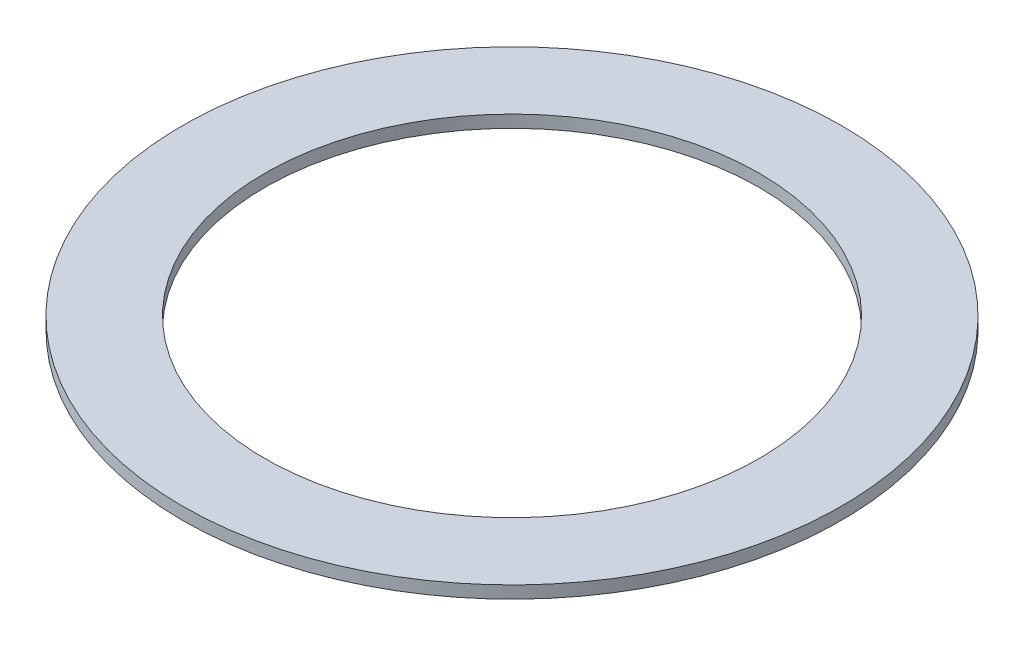
ISO-10303-21;
HEADER;
FILE_DESCRIPTION(('STEP AP214'),'2;1');
FILE_NAME('part.step','',(''),(''),'','','');
FILE_SCHEMA(('AUTOMOTIVE_DESIGN { 1 0 10303 214 1 1 1 1 }'));
ENDSEC;
DATA;
#1=APPLICATION_CONTEXT('core data for automotive mechanical design processes');
#2=APPLICATION_PROTOCOL_DEFINITION('international standard','automotive_design',2000,#1);
#3=PRODUCT_CONTEXT('',#1,'mechanical');
#4=PRODUCT('Part','Part','',(#3));
#5=PRODUCT_RELATED_PRODUCT_CATEGORY('part','',(#4));
#6=PRODUCT_DEFINITION_FORMATION('','',#4);
#7=PRODUCT_DEFINITION_CONTEXT('part definition',#1,'design');
#8=PRODUCT_DEFINITION('design','',#6,#7);
#9=PRODUCT_DEFINITION_SHAPE('','',#8);
#10=(LENGTH_UNIT() NAMED_UNIT(*) SI_UNIT(.MILLI.,.METRE.));
#11=(NAMED_UNIT(*) PLANE_ANGLE_UNIT() SI_UNIT($,.RADIAN.));
#12=(NAMED_UNIT(*) SI_UNIT($,.STERADIAN.) SOLID_ANGLE_UNIT());
#13=UNCERTAINTY_MEASURE_WITH_UNIT(LENGTH_MEASURE(1.E-05),#10,'distance_accuracy_value','');
#14=(GEOMETRIC_REPRESENTATION_CONTEXT(3) GLOBAL_UNCERTAINTY_ASSIGNED_CONTEXT((#13)) GLOBAL_UNIT_ASSIGNED_CONTEXT((#10,
#11,#12)) REPRESENTATION_CONTEXT('',''));
#15=CARTESIAN_POINT('',(0.,0.,0.));
#16=DIRECTION('',(0.,0.,1.));
#17=DIRECTION('',(1.,0.,0.));
#18=AXIS2_PLACEMENT_3D('',#15,#16,#17);
#19=CARTESIAN_POINT('',(0.,69.15,0.));
#20=DIRECTION('',(0.,1.,0.));
#21=DIRECTION('',(0.,0.,1.));
#22=AXIS2_PLACEMENT_3D('',#19,#20,#21);
#23=CYLINDRICAL_SURFACE('',#22,8.);
#24=CARTESIAN_POINT('',(0.,70.15,0.));
#25=DIRECTION('',(0.,-1.,0.));
#26=DIRECTION('',(0.,0.,-1.));
#27=AXIS2_PLACEMENT_3D('',#24,#25,#26);
#28=CIRCLE('',#27,8.);
#29=CARTESIAN_POINT('',(0.,70.15,-8.));
#30=VERTEX_POINT('',#29);
#31=EDGE_CURVE('E10',#30,#30,#28,.T.);
#32=ORIENTED_EDGE('',*,*,#31,.T.);
#33=EDGE_LOOP('',(#32));
#34=FACE_BOUND('',#33,.T.);
#35=CARTESIAN_POINT('',(0.,69.85,0.));
#36=DIRECTION('',(0.,-1.,0.));
#37=DIRECTION('',(0.,0.,-1.));
#38=AXIS2_PLACEMENT_3D('',#35,#36,#37);
#39=CIRCLE('',#38,8.);
#40=CARTESIAN_POINT('',(0.,69.85,-8.));
#41=VERTEX_POINT('',#40);
#42=EDGE_CURVE('E51',#41,#41,#39,.T.);
#43=ORIENTED_EDGE('',*,*,#42,.F.);
#44=EDGE_LOOP('',(#43));
#45=FACE_BOUND('',#44,.T.);
#46=ADVANCED_FACE('F38',(#34,#45),#23,.T.);
#47=CARTESIAN_POINT('',(0.,69.15,0.));
#48=DIRECTION('',(0.,1.,0.));
#49=DIRECTION('',(0.,0.,1.));
#50=AXIS2_PLACEMENT_3D('',#47,#48,#49);
#51=CYLINDRICAL_SURFACE('',#50,6.);
#52=CARTESIAN_POINT('',(0.,70.15,0.));
#53=DIRECTION('',(0.,-1.,0.));
#54=DIRECTION('',(0.,0.,-1.));
#55=AXIS2_PLACEMENT_3D('',#52,#53,#54);
#56=CIRCLE('',#55,6.);
#57=CARTESIAN_POINT('',(0.,70.15,-6.));
#58=VERTEX_POINT('',#57);
#59=EDGE_CURVE('E45',#58,#58,#56,.T.);
#60=ORIENTED_EDGE('',*,*,#59,.F.);
#61=EDGE_LOOP('',(#60));
#62=FACE_BOUND('',#61,.T.);
#63=CARTESIAN_POINT('',(0.,69.85,0.));
#64=DIRECTION('',(0.,-1.,0.));
#65=DIRECTION('',(0.,0.,-1.));
#66=AXIS2_PLACEMENT_3D('',#63,#64,#65);
#67=CIRCLE('',#66,6.);
#68=CARTESIAN_POINT('',(0.,69.85,-6.));
#69=VERTEX_POINT('',#68);
#70=EDGE_CURVE('E41',#69,#69,#67,.T.);
#71=ORIENTED_EDGE('',*,*,#70,.T.);
#72=EDGE_LOOP('',(#71));
#73=FACE_BOUND('',#72,.T.);
#74=ADVANCED_FACE('F58',(#62,#73),#51,.F.);
#75=CARTESIAN_POINT('',(0.,70.15,0.));
#76=DIRECTION('',(0.,-1.,0.));
#77=DIRECTION('',(0.,0.,-1.));
#78=AXIS2_PLACEMENT_3D('',#75,#76,#77);
#79=PLANE('',#78);
#80=ORIENTED_EDGE('',*,*,#31,.F.);
#81=EDGE_LOOP('',(#80));
#82=FACE_BOUND('',#81,.T.);
#83=ORIENTED_EDGE('',*,*,#59,.T.);
#84=EDGE_LOOP('',(#83));
#85=FACE_BOUND('',#84,.T.);
#86=ADVANCED_FACE('F62',(#82,#85),#79,.F.);
#87=CARTESIAN_POINT('',(0.,69.85,0.));
#88=DIRECTION('',(0.,-1.,0.));
#89=DIRECTION('',(0.,0.,-1.));
#90=AXIS2_PLACEMENT_3D('',#87,#88,#89);
#91=PLANE('',#90);
#92=ORIENTED_EDGE('',*,*,#70,.F.);
#93=EDGE_LOOP('',(#92));
#94=FACE_BOUND('',#93,.T.);
#95=ORIENTED_EDGE('',*,*,#42,.T.);
#96=EDGE_LOOP('',(#95));
#97=FACE_BOUND('',#96,.T.);
#98=ADVANCED_FACE('F60',(#94,#97),#91,.T.);
#99=CLOSED_SHELL('',(#46,#74,#86,#98));
#100=MANIFOLD_SOLID_BREP('B2',#99);
#101=ADVANCED_BREP_SHAPE_REPRESENTATION('',(#18,#100),#14);
#102=SHAPE_DEFINITION_REPRESENTATION(#9,#101);
ENDSEC;
END-ISO-10303-21;
